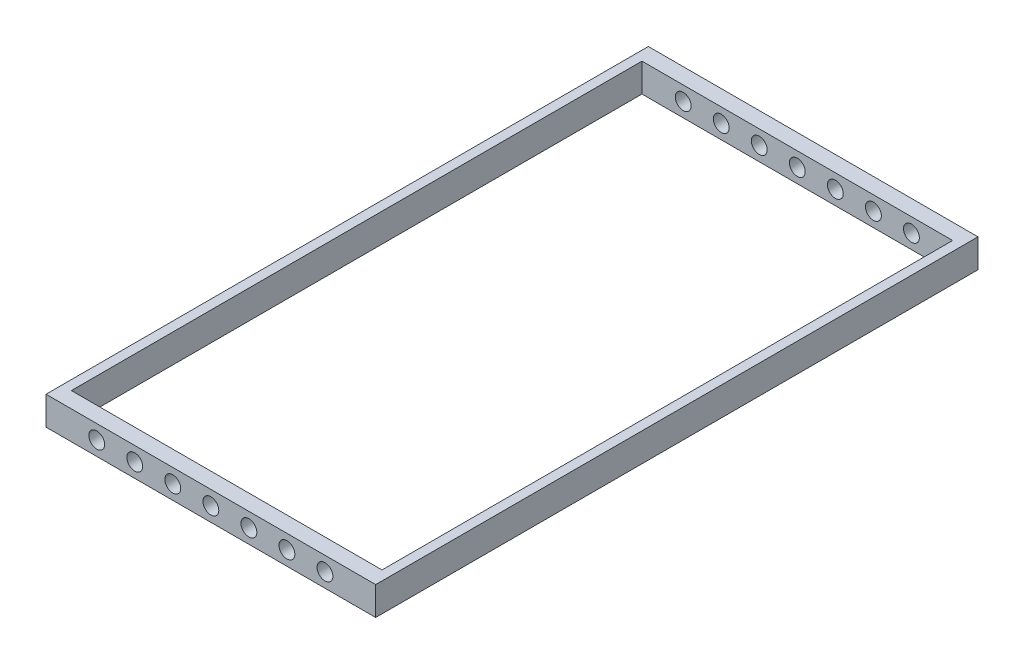
ISO-10303-21;
HEADER;
FILE_DESCRIPTION(('STEP AP214'),'2;1');
FILE_NAME('part.step','',(''),(''),'','','');
FILE_SCHEMA(('AUTOMOTIVE_DESIGN { 1 0 10303 214 1 1 1 1 }'));
ENDSEC;
DATA;
#1=APPLICATION_CONTEXT('core data for automotive mechanical design processes');
#2=APPLICATION_PROTOCOL_DEFINITION('international standard','automotive_design',2000,#1);
#3=PRODUCT_CONTEXT('',#1,'mechanical');
#4=PRODUCT('Part','Part','',(#3));
#5=PRODUCT_RELATED_PRODUCT_CATEGORY('part','',(#4));
#6=PRODUCT_DEFINITION_FORMATION('','',#4);
#7=PRODUCT_DEFINITION_CONTEXT('part definition',#1,'design');
#8=PRODUCT_DEFINITION('design','',#6,#7);
#9=PRODUCT_DEFINITION_SHAPE('','',#8);
#10=(LENGTH_UNIT() NAMED_UNIT(*) SI_UNIT(.MILLI.,.METRE.));
#11=(NAMED_UNIT(*) PLANE_ANGLE_UNIT() SI_UNIT($,.RADIAN.));
#12=(NAMED_UNIT(*) SI_UNIT($,.STERADIAN.) SOLID_ANGLE_UNIT());
#13=UNCERTAINTY_MEASURE_WITH_UNIT(LENGTH_MEASURE(1.E-05),#10,'distance_accuracy_value','');
#14=(GEOMETRIC_REPRESENTATION_CONTEXT(3) GLOBAL_UNCERTAINTY_ASSIGNED_CONTEXT((#13)) GLOBAL_UNIT_ASSIGNED_CONTEXT((#10,
#11,#12)) REPRESENTATION_CONTEXT('',''));
#15=CARTESIAN_POINT('',(0.,0.,0.));
#16=DIRECTION('',(0.,0.,1.));
#17=DIRECTION('',(1.,0.,0.));
#18=AXIS2_PLACEMENT_3D('',#15,#16,#17);
#19=CARTESIAN_POINT('',(0.,0.,0.));
#20=DIRECTION('',(0.,0.,1.));
#21=DIRECTION('',(1.,0.,0.));
#22=AXIS2_PLACEMENT_3D('',#19,#20,#21);
#23=PLANE('',#22);
#24=CARTESIAN_POINT('',(-36.,0.,0.));
#25=DIRECTION('',(0.,0.,1.));
#26=DIRECTION('',(1.,0.,0.));
#27=AXIS2_PLACEMENT_3D('',#24,#25,#26);
#28=CIRCLE('',#27,2.5);
#29=CARTESIAN_POINT('',(-33.5,0.,0.));
#30=VERTEX_POINT('',#29);
#31=EDGE_CURVE('E266',#30,#30,#28,.T.);
#32=ORIENTED_EDGE('',*,*,#31,.T.);
#33=EDGE_LOOP('',(#32));
#34=FACE_BOUND('',#33,.T.);
#35=CARTESIAN_POINT('',(-24.,0.,0.));
#36=DIRECTION('',(0.,0.,1.));
#37=DIRECTION('',(1.,0.,0.));
#38=AXIS2_PLACEMENT_3D('',#35,#36,#37);
#39=CIRCLE('',#38,2.5);
#40=CARTESIAN_POINT('',(-21.5,0.,0.));
#41=VERTEX_POINT('',#40);
#42=EDGE_CURVE('E258',#41,#41,#39,.T.);
#43=ORIENTED_EDGE('',*,*,#42,.T.);
#44=EDGE_LOOP('',(#43));
#45=FACE_BOUND('',#44,.T.);
#46=CARTESIAN_POINT('',(-12.,0.,0.));
#47=DIRECTION('',(0.,0.,1.));
#48=DIRECTION('',(1.,0.,0.));
#49=AXIS2_PLACEMENT_3D('',#46,#47,#48);
#50=CIRCLE('',#49,2.5);
#51=CARTESIAN_POINT('',(-9.50000000000003,0.,0.));
#52=VERTEX_POINT('',#51);
#53=EDGE_CURVE('E250',#52,#52,#50,.T.);
#54=ORIENTED_EDGE('',*,*,#53,.T.);
#55=EDGE_LOOP('',(#54));
#56=FACE_BOUND('',#55,.T.);
#57=CARTESIAN_POINT('',(0.,0.,0.));
#58=DIRECTION('',(0.,0.,1.));
#59=DIRECTION('',(1.,0.,0.));
#60=AXIS2_PLACEMENT_3D('',#57,#58,#59);
#61=CIRCLE('',#60,2.5);
#62=CARTESIAN_POINT('',(2.49999999999997,0.,0.));
#63=VERTEX_POINT('',#62);
#64=EDGE_CURVE('E242',#63,#63,#61,.T.);
#65=ORIENTED_EDGE('',*,*,#64,.T.);
#66=EDGE_LOOP('',(#65));
#67=FACE_BOUND('',#66,.T.);
#68=CARTESIAN_POINT('',(12.,0.,0.));
#69=DIRECTION('',(0.,0.,1.));
#70=DIRECTION('',(1.,0.,0.));
#71=AXIS2_PLACEMENT_3D('',#68,#69,#70);
#72=CIRCLE('',#71,2.5);
#73=CARTESIAN_POINT('',(14.5,0.,0.));
#74=VERTEX_POINT('',#73);
#75=EDGE_CURVE('E234',#74,#74,#72,.T.);
#76=ORIENTED_EDGE('',*,*,#75,.T.);
#77=EDGE_LOOP('',(#76));
#78=FACE_BOUND('',#77,.T.);
#79=CARTESIAN_POINT('',(24.,0.,0.));
#80=DIRECTION('',(0.,0.,1.));
#81=DIRECTION('',(1.,0.,0.));
#82=AXIS2_PLACEMENT_3D('',#79,#80,#81);
#83=CIRCLE('',#82,2.5);
#84=CARTESIAN_POINT('',(26.5,0.,0.));
#85=VERTEX_POINT('',#84);
#86=EDGE_CURVE('E226',#85,#85,#83,.T.);
#87=ORIENTED_EDGE('',*,*,#86,.T.);
#88=EDGE_LOOP('',(#87));
#89=FACE_BOUND('',#88,.T.);
#90=CARTESIAN_POINT('',(36.,0.,0.));
#91=DIRECTION('',(0.,0.,1.));
#92=DIRECTION('',(1.,0.,0.));
#93=AXIS2_PLACEMENT_3D('',#90,#91,#92);
#94=CIRCLE('',#93,2.5);
#95=CARTESIAN_POINT('',(38.5,0.,0.));
#96=VERTEX_POINT('',#95);
#97=EDGE_CURVE('E221',#96,#96,#94,.T.);
#98=ORIENTED_EDGE('',*,*,#97,.T.);
#99=EDGE_LOOP('',(#98));
#100=FACE_BOUND('',#99,.T.);
#101=DIRECTION('',(0.,-1.,0.));
#102=VECTOR('',#101,1.);
#103=CARTESIAN_POINT('',(-49.,4.5,0.));
#104=LINE('',#103,#102);
#105=CARTESIAN_POINT('',(-49.,4.5,0.));
#106=VERTEX_POINT('',#105);
#107=CARTESIAN_POINT('',(-49.,-4.5,0.));
#108=VERTEX_POINT('',#107);
#109=EDGE_CURVE('E203',#106,#108,#104,.T.);
#110=ORIENTED_EDGE('',*,*,#109,.F.);
#111=DIRECTION('',(-1.,0.,0.));
#112=VECTOR('',#111,1.);
#113=CARTESIAN_POINT('',(-52.,4.5,0.));
#114=LINE('',#113,#112);
#115=CARTESIAN_POINT('',(49.,4.5,0.));
#116=VERTEX_POINT('',#115);
#117=EDGE_CURVE('E109',#116,#106,#114,.T.);
#118=ORIENTED_EDGE('',*,*,#117,.F.);
#119=DIRECTION('',(0.,1.,0.));
#120=VECTOR('',#119,1.);
#121=CARTESIAN_POINT('',(49.,4.5,0.));
#122=LINE('',#121,#120);
#123=CARTESIAN_POINT('',(49.,-4.5,0.));
#124=VERTEX_POINT('',#123);
#125=EDGE_CURVE('E114',#124,#116,#122,.T.);
#126=ORIENTED_EDGE('',*,*,#125,.F.);
#127=DIRECTION('',(1.,0.,0.));
#128=VECTOR('',#127,1.);
#129=CARTESIAN_POINT('',(-52.,-4.5,0.));
#130=LINE('',#129,#128);
#131=EDGE_CURVE('E60',#108,#124,#130,.T.);
#132=ORIENTED_EDGE('',*,*,#131,.F.);
#133=EDGE_LOOP('',(#110,#118,#126,#132));
#134=FACE_BOUND('',#133,.T.);
#135=ADVANCED_FACE('F39',(#34,#45,#56,#67,#78,#89,#100,#134),#23,.F.);
#136=CARTESIAN_POINT('',(0.,0.,5.));
#137=DIRECTION('',(0.,0.,1.));
#138=DIRECTION('',(1.,0.,0.));
#139=AXIS2_PLACEMENT_3D('',#136,#137,#138);
#140=PLANE('',#139);
#141=CARTESIAN_POINT('',(24.,0.,5.));
#142=DIRECTION('',(0.,0.,1.));
#143=DIRECTION('',(1.,0.,0.));
#144=AXIS2_PLACEMENT_3D('',#141,#142,#143);
#145=CIRCLE('',#144,2.5);
#146=CARTESIAN_POINT('',(26.5,0.,5.));
#147=VERTEX_POINT('',#146);
#148=EDGE_CURVE('E230',#147,#147,#145,.T.);
#149=ORIENTED_EDGE('',*,*,#148,.F.);
#150=EDGE_LOOP('',(#149));
#151=FACE_BOUND('',#150,.T.);
#152=CARTESIAN_POINT('',(0.,0.,5.));
#153=DIRECTION('',(0.,0.,1.));
#154=DIRECTION('',(1.,0.,0.));
#155=AXIS2_PLACEMENT_3D('',#152,#153,#154);
#156=CIRCLE('',#155,2.5);
#157=CARTESIAN_POINT('',(2.49999999999997,0.,5.));
#158=VERTEX_POINT('',#157);
#159=EDGE_CURVE('E246',#158,#158,#156,.T.);
#160=ORIENTED_EDGE('',*,*,#159,.F.);
#161=EDGE_LOOP('',(#160));
#162=FACE_BOUND('',#161,.T.);
#163=CARTESIAN_POINT('',(-24.,0.,5.));
#164=DIRECTION('',(0.,0.,1.));
#165=DIRECTION('',(1.,0.,0.));
#166=AXIS2_PLACEMENT_3D('',#163,#164,#165);
#167=CIRCLE('',#166,2.5);
#168=CARTESIAN_POINT('',(-21.5,0.,5.));
#169=VERTEX_POINT('',#168);
#170=EDGE_CURVE('E262',#169,#169,#167,.T.);
#171=ORIENTED_EDGE('',*,*,#170,.F.);
#172=EDGE_LOOP('',(#171));
#173=FACE_BOUND('',#172,.T.);
#174=DIRECTION('',(0.,1.,0.));
#175=VECTOR('',#174,1.);
#176=CARTESIAN_POINT('',(52.,4.5,5.));
#177=LINE('',#176,#175);
#178=CARTESIAN_POINT('',(52.,-4.5,5.));
#179=VERTEX_POINT('',#178);
#180=CARTESIAN_POINT('',(52.,4.5,5.));
#181=VERTEX_POINT('',#180);
#182=EDGE_CURVE('E277',#179,#181,#177,.T.);
#183=ORIENTED_EDGE('',*,*,#182,.T.);
#184=DIRECTION('',(-1.,0.,0.));
#185=VECTOR('',#184,1.);
#186=CARTESIAN_POINT('',(-52.,4.5,5.));
#187=LINE('',#186,#185);
#188=CARTESIAN_POINT('',(-52.,4.5,5.));
#189=VERTEX_POINT('',#188);
#190=EDGE_CURVE('E281',#181,#189,#187,.T.);
#191=ORIENTED_EDGE('',*,*,#190,.T.);
#192=DIRECTION('',(0.,-1.,0.));
#193=VECTOR('',#192,1.);
#194=CARTESIAN_POINT('',(-52.,4.5,5.));
#195=LINE('',#194,#193);
#196=CARTESIAN_POINT('',(-52.,-4.5,5.));
#197=VERTEX_POINT('',#196);
#198=EDGE_CURVE('E284',#189,#197,#195,.T.);
#199=ORIENTED_EDGE('',*,*,#198,.T.);
#200=DIRECTION('',(1.,0.,0.));
#201=VECTOR('',#200,1.);
#202=CARTESIAN_POINT('',(-52.,-4.5,5.));
#203=LINE('',#202,#201);
#204=EDGE_CURVE('E287',#197,#179,#203,.T.);
#205=ORIENTED_EDGE('',*,*,#204,.T.);
#206=EDGE_LOOP('',(#183,#191,#199,#205));
#207=FACE_BOUND('',#206,.T.);
#208=CARTESIAN_POINT('',(-36.,0.,5.));
#209=DIRECTION('',(0.,0.,1.));
#210=DIRECTION('',(1.,0.,0.));
#211=AXIS2_PLACEMENT_3D('',#208,#209,#210);
#212=CIRCLE('',#211,2.5);
#213=CARTESIAN_POINT('',(-33.5,0.,5.));
#214=VERTEX_POINT('',#213);
#215=EDGE_CURVE('E270',#214,#214,#212,.T.);
#216=ORIENTED_EDGE('',*,*,#215,.F.);
#217=EDGE_LOOP('',(#216));
#218=FACE_BOUND('',#217,.T.);
#219=CARTESIAN_POINT('',(-12.,0.,5.));
#220=DIRECTION('',(0.,0.,1.));
#221=DIRECTION('',(1.,0.,0.));
#222=AXIS2_PLACEMENT_3D('',#219,#220,#221);
#223=CIRCLE('',#222,2.5);
#224=CARTESIAN_POINT('',(-9.50000000000003,0.,5.));
#225=VERTEX_POINT('',#224);
#226=EDGE_CURVE('E254',#225,#225,#223,.T.);
#227=ORIENTED_EDGE('',*,*,#226,.F.);
#228=EDGE_LOOP('',(#227));
#229=FACE_BOUND('',#228,.T.);
#230=CARTESIAN_POINT('',(12.,0.,5.));
#231=DIRECTION('',(0.,0.,1.));
#232=DIRECTION('',(1.,0.,0.));
#233=AXIS2_PLACEMENT_3D('',#230,#231,#232);
#234=CIRCLE('',#233,2.5);
#235=CARTESIAN_POINT('',(14.5,0.,5.));
#236=VERTEX_POINT('',#235);
#237=EDGE_CURVE('E238',#236,#236,#234,.T.);
#238=ORIENTED_EDGE('',*,*,#237,.F.);
#239=EDGE_LOOP('',(#238));
#240=FACE_BOUND('',#239,.T.);
#241=CARTESIAN_POINT('',(36.,0.,5.));
#242=DIRECTION('',(0.,0.,1.));
#243=DIRECTION('',(1.,0.,0.));
#244=AXIS2_PLACEMENT_3D('',#241,#242,#243);
#245=CIRCLE('',#244,2.5);
#246=CARTESIAN_POINT('',(38.5,0.,5.));
#247=VERTEX_POINT('',#246);
#248=EDGE_CURVE('E222',#247,#247,#245,.T.);
#249=ORIENTED_EDGE('',*,*,#248,.F.);
#250=EDGE_LOOP('',(#249));
#251=FACE_BOUND('',#250,.T.);
#252=ADVANCED_FACE('F320',(#151,#162,#173,#207,#218,#229,#240,#251),#140,.T.);
#253=CARTESIAN_POINT('',(52.,4.5,5.));
#254=DIRECTION('',(-1.,0.,0.));
#255=DIRECTION('',(0.,0.,1.));
#256=AXIS2_PLACEMENT_3D('',#253,#254,#255);
#257=PLANE('',#256);
#258=DIRECTION('',(0.,0.,-1.));
#259=VECTOR('',#258,1.);
#260=CARTESIAN_POINT('',(52.,-4.5,5.));
#261=LINE('',#260,#259);
#262=CARTESIAN_POINT('',(52.,-4.5,-185.));
#263=VERTEX_POINT('',#262);
#264=EDGE_CURVE('E290',#179,#263,#261,.T.);
#265=ORIENTED_EDGE('',*,*,#264,.T.);
#266=DIRECTION('',(0.,1.,0.));
#267=VECTOR('',#266,1.);
#268=CARTESIAN_POINT('',(52.,4.5,-185.));
#269=LINE('',#268,#267);
#270=CARTESIAN_POINT('',(52.,4.5,-185.));
#271=VERTEX_POINT('',#270);
#272=EDGE_CURVE('E188',#263,#271,#269,.T.);
#273=ORIENTED_EDGE('',*,*,#272,.T.);
#274=DIRECTION('',(0.,0.,-1.));
#275=VECTOR('',#274,1.);
#276=CARTESIAN_POINT('',(52.,4.5,5.));
#277=LINE('',#276,#275);
#278=EDGE_CURVE('E11',#181,#271,#277,.T.);
#279=ORIENTED_EDGE('',*,*,#278,.F.);
#280=ORIENTED_EDGE('',*,*,#182,.F.);
#281=EDGE_LOOP('',(#265,#273,#279,#280));
#282=FACE_BOUND('',#281,.T.);
#283=ADVANCED_FACE('F41',(#282),#257,.F.);
#284=CARTESIAN_POINT('',(-52.,4.5,5.));
#285=DIRECTION('',(0.,-1.,0.));
#286=DIRECTION('',(0.,0.,-1.));
#287=AXIS2_PLACEMENT_3D('',#284,#285,#286);
#288=PLANE('',#287);
#289=ORIENTED_EDGE('',*,*,#278,.T.);
#290=DIRECTION('',(-1.,0.,0.));
#291=VECTOR('',#290,1.);
#292=CARTESIAN_POINT('',(-52.,4.5,-185.));
#293=LINE('',#292,#291);
#294=CARTESIAN_POINT('',(-52.,4.5,-185.));
#295=VERTEX_POINT('',#294);
#296=EDGE_CURVE('E192',#271,#295,#293,.T.);
#297=ORIENTED_EDGE('',*,*,#296,.T.);
#298=DIRECTION('',(0.,0.,-1.));
#299=VECTOR('',#298,1.);
#300=CARTESIAN_POINT('',(-52.,4.5,5.));
#301=LINE('',#300,#299);
#302=EDGE_CURVE('E48',#189,#295,#301,.T.);
#303=ORIENTED_EDGE('',*,*,#302,.F.);
#304=ORIENTED_EDGE('',*,*,#190,.F.);
#305=EDGE_LOOP('',(#289,#297,#303,#304));
#306=FACE_BOUND('',#305,.T.);
#307=DIRECTION('',(-1.,0.,0.));
#308=VECTOR('',#307,1.);
#309=CARTESIAN_POINT('',(-52.,4.5,-180.));
#310=LINE('',#309,#308);
#311=CARTESIAN_POINT('',(49.,4.5,-180.));
#312=VERTEX_POINT('',#311);
#313=CARTESIAN_POINT('',(-49.,4.5,-180.));
#314=VERTEX_POINT('',#313);
#315=EDGE_CURVE('E107',#312,#314,#310,.T.);
#316=ORIENTED_EDGE('',*,*,#315,.F.);
#317=DIRECTION('',(0.,0.,1.));
#318=VECTOR('',#317,1.);
#319=CARTESIAN_POINT('',(49.,4.5,-90.));
#320=LINE('',#319,#318);
#321=EDGE_CURVE('E214',#312,#116,#320,.T.);
#322=ORIENTED_EDGE('',*,*,#321,.T.);
#323=ORIENTED_EDGE('',*,*,#117,.T.);
#324=DIRECTION('',(0.,0.,1.));
#325=VECTOR('',#324,1.);
#326=CARTESIAN_POINT('',(-49.,4.5,-90.));
#327=LINE('',#326,#325);
#328=EDGE_CURVE('E103',#314,#106,#327,.T.);
#329=ORIENTED_EDGE('',*,*,#328,.F.);
#330=EDGE_LOOP('',(#316,#322,#323,#329));
#331=FACE_BOUND('',#330,.T.);
#332=ADVANCED_FACE('F105',(#306,#331),#288,.F.);
#333=CARTESIAN_POINT('',(-52.,4.5,5.));
#334=DIRECTION('',(1.,0.,0.));
#335=DIRECTION('',(0.,0.,-1.));
#336=AXIS2_PLACEMENT_3D('',#333,#334,#335);
#337=PLANE('',#336);
#338=ORIENTED_EDGE('',*,*,#302,.T.);
#339=DIRECTION('',(0.,-1.,0.));
#340=VECTOR('',#339,1.);
#341=CARTESIAN_POINT('',(-52.,4.5,-185.));
#342=LINE('',#341,#340);
#343=CARTESIAN_POINT('',(-52.,-4.5,-185.));
#344=VERTEX_POINT('',#343);
#345=EDGE_CURVE('E196',#295,#344,#342,.T.);
#346=ORIENTED_EDGE('',*,*,#345,.T.);
#347=DIRECTION('',(0.,0.,-1.));
#348=VECTOR('',#347,1.);
#349=CARTESIAN_POINT('',(-52.,-4.5,5.));
#350=LINE('',#349,#348);
#351=EDGE_CURVE('E297',#197,#344,#350,.T.);
#352=ORIENTED_EDGE('',*,*,#351,.F.);
#353=ORIENTED_EDGE('',*,*,#198,.F.);
#354=EDGE_LOOP('',(#338,#346,#352,#353));
#355=FACE_BOUND('',#354,.T.);
#356=ADVANCED_FACE('F303',(#355),#337,.F.);
#357=CARTESIAN_POINT('',(-52.,-4.5,5.));
#358=DIRECTION('',(0.,1.,0.));
#359=DIRECTION('',(0.,0.,1.));
#360=AXIS2_PLACEMENT_3D('',#357,#358,#359);
#361=PLANE('',#360);
#362=DIRECTION('',(0.,0.,1.));
#363=VECTOR('',#362,1.);
#364=CARTESIAN_POINT('',(49.,-4.5,-90.));
#365=LINE('',#364,#363);
#366=CARTESIAN_POINT('',(49.,-4.5,-180.));
#367=VERTEX_POINT('',#366);
#368=EDGE_CURVE('E217',#367,#124,#365,.T.);
#369=ORIENTED_EDGE('',*,*,#368,.F.);
#370=DIRECTION('',(1.,0.,0.));
#371=VECTOR('',#370,1.);
#372=CARTESIAN_POINT('',(-52.,-4.5,-180.));
#373=LINE('',#372,#371);
#374=CARTESIAN_POINT('',(-49.,-4.5,-180.));
#375=VERTEX_POINT('',#374);
#376=EDGE_CURVE('E124',#375,#367,#373,.T.);
#377=ORIENTED_EDGE('',*,*,#376,.F.);
#378=DIRECTION('',(0.,0.,1.));
#379=VECTOR('',#378,1.);
#380=CARTESIAN_POINT('',(-49.,-4.5,-90.));
#381=LINE('',#380,#379);
#382=EDGE_CURVE('E55',#375,#108,#381,.T.);
#383=ORIENTED_EDGE('',*,*,#382,.T.);
#384=ORIENTED_EDGE('',*,*,#131,.T.);
#385=EDGE_LOOP('',(#369,#377,#383,#384));
#386=FACE_BOUND('',#385,.T.);
#387=ORIENTED_EDGE('',*,*,#351,.T.);
#388=DIRECTION('',(1.,0.,0.));
#389=VECTOR('',#388,1.);
#390=CARTESIAN_POINT('',(-52.,-4.5,-185.));
#391=LINE('',#390,#389);
#392=EDGE_CURVE('E200',#344,#263,#391,.T.);
#393=ORIENTED_EDGE('',*,*,#392,.T.);
#394=ORIENTED_EDGE('',*,*,#264,.F.);
#395=ORIENTED_EDGE('',*,*,#204,.F.);
#396=EDGE_LOOP('',(#387,#393,#394,#395));
#397=FACE_BOUND('',#396,.T.);
#398=ADVANCED_FACE('F316',(#386,#397),#361,.F.);
#399=CARTESIAN_POINT('',(-36.,0.,5.));
#400=DIRECTION('',(0.,0.,-1.));
#401=DIRECTION('',(-1.,0.,0.));
#402=AXIS2_PLACEMENT_3D('',#399,#400,#401);
#403=CYLINDRICAL_SURFACE('',#402,2.5);
#404=ORIENTED_EDGE('',*,*,#215,.T.);
#405=EDGE_LOOP('',(#404));
#406=FACE_BOUND('',#405,.T.);
#407=ORIENTED_EDGE('',*,*,#31,.F.);
#408=EDGE_LOOP('',(#407));
#409=FACE_BOUND('',#408,.T.);
#410=ADVANCED_FACE('F340',(#406,#409),#403,.F.);
#411=CARTESIAN_POINT('',(-24.,0.,5.));
#412=DIRECTION('',(0.,0.,-1.));
#413=DIRECTION('',(-1.,0.,0.));
#414=AXIS2_PLACEMENT_3D('',#411,#412,#413);
#415=CYLINDRICAL_SURFACE('',#414,2.5);
#416=ORIENTED_EDGE('',*,*,#170,.T.);
#417=EDGE_LOOP('',(#416));
#418=FACE_BOUND('',#417,.T.);
#419=ORIENTED_EDGE('',*,*,#42,.F.);
#420=EDGE_LOOP('',(#419));
#421=FACE_BOUND('',#420,.T.);
#422=ADVANCED_FACE('F357',(#418,#421),#415,.F.);
#423=CARTESIAN_POINT('',(-12.,0.,5.));
#424=DIRECTION('',(0.,0.,-1.));
#425=DIRECTION('',(-1.,0.,0.));
#426=AXIS2_PLACEMENT_3D('',#423,#424,#425);
#427=CYLINDRICAL_SURFACE('',#426,2.5);
#428=ORIENTED_EDGE('',*,*,#226,.T.);
#429=EDGE_LOOP('',(#428));
#430=FACE_BOUND('',#429,.T.);
#431=ORIENTED_EDGE('',*,*,#53,.F.);
#432=EDGE_LOOP('',(#431));
#433=FACE_BOUND('',#432,.T.);
#434=ADVANCED_FACE('F365',(#430,#433),#427,.F.);
#435=CARTESIAN_POINT('',(0.,0.,5.));
#436=DIRECTION('',(0.,0.,-1.));
#437=DIRECTION('',(-1.,0.,0.));
#438=AXIS2_PLACEMENT_3D('',#435,#436,#437);
#439=CYLINDRICAL_SURFACE('',#438,2.5);
#440=ORIENTED_EDGE('',*,*,#159,.T.);
#441=EDGE_LOOP('',(#440));
#442=FACE_BOUND('',#441,.T.);
#443=ORIENTED_EDGE('',*,*,#64,.F.);
#444=EDGE_LOOP('',(#443));
#445=FACE_BOUND('',#444,.T.);
#446=ADVANCED_FACE('F373',(#442,#445),#439,.F.);
#447=CARTESIAN_POINT('',(12.,0.,5.));
#448=DIRECTION('',(0.,0.,-1.));
#449=DIRECTION('',(-1.,0.,0.));
#450=AXIS2_PLACEMENT_3D('',#447,#448,#449);
#451=CYLINDRICAL_SURFACE('',#450,2.5);
#452=ORIENTED_EDGE('',*,*,#237,.T.);
#453=EDGE_LOOP('',(#452));
#454=FACE_BOUND('',#453,.T.);
#455=ORIENTED_EDGE('',*,*,#75,.F.);
#456=EDGE_LOOP('',(#455));
#457=FACE_BOUND('',#456,.T.);
#458=ADVANCED_FACE('F381',(#454,#457),#451,.F.);
#459=CARTESIAN_POINT('',(24.,0.,5.));
#460=DIRECTION('',(0.,0.,-1.));
#461=DIRECTION('',(-1.,0.,0.));
#462=AXIS2_PLACEMENT_3D('',#459,#460,#461);
#463=CYLINDRICAL_SURFACE('',#462,2.5);
#464=ORIENTED_EDGE('',*,*,#148,.T.);
#465=EDGE_LOOP('',(#464));
#466=FACE_BOUND('',#465,.T.);
#467=ORIENTED_EDGE('',*,*,#86,.F.);
#468=EDGE_LOOP('',(#467));
#469=FACE_BOUND('',#468,.T.);
#470=ADVANCED_FACE('F389',(#466,#469),#463,.F.);
#471=CARTESIAN_POINT('',(36.,0.,5.));
#472=DIRECTION('',(0.,0.,-1.));
#473=DIRECTION('',(-1.,0.,0.));
#474=AXIS2_PLACEMENT_3D('',#471,#472,#473);
#475=CYLINDRICAL_SURFACE('',#474,2.5);
#476=ORIENTED_EDGE('',*,*,#248,.T.);
#477=EDGE_LOOP('',(#476));
#478=FACE_BOUND('',#477,.T.);
#479=ORIENTED_EDGE('',*,*,#97,.F.);
#480=EDGE_LOOP('',(#479));
#481=FACE_BOUND('',#480,.T.);
#482=ADVANCED_FACE('F397',(#478,#481),#475,.F.);
#483=CARTESIAN_POINT('',(49.,4.5,-90.));
#484=DIRECTION('',(1.,0.,0.));
#485=DIRECTION('',(0.,1.,0.));
#486=AXIS2_PLACEMENT_3D('',#483,#484,#485);
#487=PLANE('',#486);
#488=ORIENTED_EDGE('',*,*,#125,.T.);
#489=ORIENTED_EDGE('',*,*,#321,.F.);
#490=DIRECTION('',(0.,1.,0.));
#491=VECTOR('',#490,1.);
#492=CARTESIAN_POINT('',(49.,4.5,-180.));
#493=LINE('',#492,#491);
#494=EDGE_CURVE('E122',#367,#312,#493,.T.);
#495=ORIENTED_EDGE('',*,*,#494,.F.);
#496=ORIENTED_EDGE('',*,*,#368,.T.);
#497=EDGE_LOOP('',(#488,#489,#495,#496));
#498=FACE_BOUND('',#497,.T.);
#499=ADVANCED_FACE('F405',(#498),#487,.F.);
#500=CARTESIAN_POINT('',(-49.,4.5,-90.));
#501=DIRECTION('',(-1.,0.,0.));
#502=DIRECTION('',(0.,0.,1.));
#503=AXIS2_PLACEMENT_3D('',#500,#501,#502);
#504=PLANE('',#503);
#505=ORIENTED_EDGE('',*,*,#109,.T.);
#506=ORIENTED_EDGE('',*,*,#382,.F.);
#507=DIRECTION('',(0.,-1.,0.));
#508=VECTOR('',#507,1.);
#509=CARTESIAN_POINT('',(-49.,4.5,-180.));
#510=LINE('',#509,#508);
#511=EDGE_CURVE('E120',#314,#375,#510,.T.);
#512=ORIENTED_EDGE('',*,*,#511,.F.);
#513=ORIENTED_EDGE('',*,*,#328,.T.);
#514=EDGE_LOOP('',(#505,#506,#512,#513));
#515=FACE_BOUND('',#514,.T.);
#516=ADVANCED_FACE('F127',(#515),#504,.F.);
#517=CARTESIAN_POINT('',(0.,0.,-180.));
#518=DIRECTION('',(0.,0.,-1.));
#519=DIRECTION('',(1.,0.,0.));
#520=AXIS2_PLACEMENT_3D('',#517,#518,#519);
#521=PLANE('',#520);
#522=CARTESIAN_POINT('',(-36.,0.,-180.));
#523=DIRECTION('',(0.,0.,1.));
#524=DIRECTION('',(1.,0.,0.));
#525=AXIS2_PLACEMENT_3D('',#522,#523,#524);
#526=CIRCLE('',#525,2.5);
#527=CARTESIAN_POINT('',(-33.5,0.,-180.));
#528=VERTEX_POINT('',#527);
#529=EDGE_CURVE('E178',#528,#528,#526,.T.);
#530=ORIENTED_EDGE('',*,*,#529,.F.);
#531=EDGE_LOOP('',(#530));
#532=FACE_BOUND('',#531,.T.);
#533=CARTESIAN_POINT('',(-24.,0.,-180.));
#534=DIRECTION('',(0.,0.,1.));
#535=DIRECTION('',(1.,0.,0.));
#536=AXIS2_PLACEMENT_3D('',#533,#534,#535);
#537=CIRCLE('',#536,2.5);
#538=CARTESIAN_POINT('',(-21.5,0.,-180.));
#539=VERTEX_POINT('',#538);
#540=EDGE_CURVE('E170',#539,#539,#537,.T.);
#541=ORIENTED_EDGE('',*,*,#540,.F.);
#542=EDGE_LOOP('',(#541));
#543=FACE_BOUND('',#542,.T.);
#544=CARTESIAN_POINT('',(-12.,0.,-180.));
#545=DIRECTION('',(0.,0.,1.));
#546=DIRECTION('',(1.,0.,0.));
#547=AXIS2_PLACEMENT_3D('',#544,#545,#546);
#548=CIRCLE('',#547,2.5);
#549=CARTESIAN_POINT('',(-9.50000000000003,0.,-180.));
#550=VERTEX_POINT('',#549);
#551=EDGE_CURVE('E162',#550,#550,#548,.T.);
#552=ORIENTED_EDGE('',*,*,#551,.F.);
#553=EDGE_LOOP('',(#552));
#554=FACE_BOUND('',#553,.T.);
#555=CARTESIAN_POINT('',(0.,0.,-180.));
#556=DIRECTION('',(0.,0.,1.));
#557=DIRECTION('',(1.,0.,0.));
#558=AXIS2_PLACEMENT_3D('',#555,#556,#557);
#559=CIRCLE('',#558,2.5);
#560=CARTESIAN_POINT('',(2.49999999999997,0.,-180.));
#561=VERTEX_POINT('',#560);
#562=EDGE_CURVE('E154',#561,#561,#559,.T.);
#563=ORIENTED_EDGE('',*,*,#562,.F.);
#564=EDGE_LOOP('',(#563));
#565=FACE_BOUND('',#564,.T.);
#566=CARTESIAN_POINT('',(12.,0.,-180.));
#567=DIRECTION('',(0.,0.,1.));
#568=DIRECTION('',(1.,0.,0.));
#569=AXIS2_PLACEMENT_3D('',#566,#567,#568);
#570=CIRCLE('',#569,2.5);
#571=CARTESIAN_POINT('',(14.5,0.,-180.));
#572=VERTEX_POINT('',#571);
#573=EDGE_CURVE('E146',#572,#572,#570,.T.);
#574=ORIENTED_EDGE('',*,*,#573,.F.);
#575=EDGE_LOOP('',(#574));
#576=FACE_BOUND('',#575,.T.);
#577=CARTESIAN_POINT('',(24.,0.,-180.));
#578=DIRECTION('',(0.,0.,1.));
#579=DIRECTION('',(1.,0.,0.));
#580=AXIS2_PLACEMENT_3D('',#577,#578,#579);
#581=CIRCLE('',#580,2.5);
#582=CARTESIAN_POINT('',(26.5,0.,-180.));
#583=VERTEX_POINT('',#582);
#584=EDGE_CURVE('E138',#583,#583,#581,.T.);
#585=ORIENTED_EDGE('',*,*,#584,.F.);
#586=EDGE_LOOP('',(#585));
#587=FACE_BOUND('',#586,.T.);
#588=CARTESIAN_POINT('',(36.,0.,-180.));
#589=DIRECTION('',(0.,0.,1.));
#590=DIRECTION('',(1.,0.,0.));
#591=AXIS2_PLACEMENT_3D('',#588,#589,#590);
#592=CIRCLE('',#591,2.5);
#593=CARTESIAN_POINT('',(38.5,0.,-180.));
#594=VERTEX_POINT('',#593);
#595=EDGE_CURVE('E131',#594,#594,#592,.T.);
#596=ORIENTED_EDGE('',*,*,#595,.F.);
#597=EDGE_LOOP('',(#596));
#598=FACE_BOUND('',#597,.T.);
#599=ORIENTED_EDGE('',*,*,#511,.T.);
#600=ORIENTED_EDGE('',*,*,#376,.T.);
#601=ORIENTED_EDGE('',*,*,#494,.T.);
#602=ORIENTED_EDGE('',*,*,#315,.T.);
#603=EDGE_LOOP('',(#599,#600,#601,#602));
#604=FACE_BOUND('',#603,.T.);
#605=ADVANCED_FACE('F118',(#532,#543,#554,#565,#576,#587,#598,#604),#521,.F.);
#606=CARTESIAN_POINT('',(0.,0.,-185.));
#607=DIRECTION('',(0.,0.,-1.));
#608=DIRECTION('',(1.,0.,0.));
#609=AXIS2_PLACEMENT_3D('',#606,#607,#608);
#610=PLANE('',#609);
#611=CARTESIAN_POINT('',(24.,0.,-185.));
#612=DIRECTION('',(0.,0.,1.));
#613=DIRECTION('',(1.,0.,0.));
#614=AXIS2_PLACEMENT_3D('',#611,#612,#613);
#615=CIRCLE('',#614,2.5);
#616=CARTESIAN_POINT('',(26.5,0.,-185.));
#617=VERTEX_POINT('',#616);
#618=EDGE_CURVE('E142',#617,#617,#615,.T.);
#619=ORIENTED_EDGE('',*,*,#618,.T.);
#620=EDGE_LOOP('',(#619));
#621=FACE_BOUND('',#620,.T.);
#622=CARTESIAN_POINT('',(0.,0.,-185.));
#623=DIRECTION('',(0.,0.,1.));
#624=DIRECTION('',(1.,0.,0.));
#625=AXIS2_PLACEMENT_3D('',#622,#623,#624);
#626=CIRCLE('',#625,2.5);
#627=CARTESIAN_POINT('',(2.49999999999997,0.,-185.));
#628=VERTEX_POINT('',#627);
#629=EDGE_CURVE('E158',#628,#628,#626,.T.);
#630=ORIENTED_EDGE('',*,*,#629,.T.);
#631=EDGE_LOOP('',(#630));
#632=FACE_BOUND('',#631,.T.);
#633=CARTESIAN_POINT('',(-24.,0.,-185.));
#634=DIRECTION('',(0.,0.,1.));
#635=DIRECTION('',(1.,0.,0.));
#636=AXIS2_PLACEMENT_3D('',#633,#634,#635);
#637=CIRCLE('',#636,2.5);
#638=CARTESIAN_POINT('',(-21.5,0.,-185.));
#639=VERTEX_POINT('',#638);
#640=EDGE_CURVE('E174',#639,#639,#637,.T.);
#641=ORIENTED_EDGE('',*,*,#640,.T.);
#642=EDGE_LOOP('',(#641));
#643=FACE_BOUND('',#642,.T.);
#644=ORIENTED_EDGE('',*,*,#272,.F.);
#645=ORIENTED_EDGE('',*,*,#392,.F.);
#646=ORIENTED_EDGE('',*,*,#345,.F.);
#647=ORIENTED_EDGE('',*,*,#296,.F.);
#648=EDGE_LOOP('',(#644,#645,#646,#647));
#649=FACE_BOUND('',#648,.T.);
#650=CARTESIAN_POINT('',(-36.,0.,-185.));
#651=DIRECTION('',(0.,0.,1.));
#652=DIRECTION('',(1.,0.,0.));
#653=AXIS2_PLACEMENT_3D('',#650,#651,#652);
#654=CIRCLE('',#653,2.5);
#655=CARTESIAN_POINT('',(-33.5,0.,-185.));
#656=VERTEX_POINT('',#655);
#657=EDGE_CURVE('E125',#656,#656,#654,.T.);
#658=ORIENTED_EDGE('',*,*,#657,.T.);
#659=EDGE_LOOP('',(#658));
#660=FACE_BOUND('',#659,.T.);
#661=CARTESIAN_POINT('',(-12.,0.,-185.));
#662=DIRECTION('',(0.,0.,1.));
#663=DIRECTION('',(1.,0.,0.));
#664=AXIS2_PLACEMENT_3D('',#661,#662,#663);
#665=CIRCLE('',#664,2.5);
#666=CARTESIAN_POINT('',(-9.50000000000003,0.,-185.));
#667=VERTEX_POINT('',#666);
#668=EDGE_CURVE('E166',#667,#667,#665,.T.);
#669=ORIENTED_EDGE('',*,*,#668,.T.);
#670=EDGE_LOOP('',(#669));
#671=FACE_BOUND('',#670,.T.);
#672=CARTESIAN_POINT('',(12.,0.,-185.));
#673=DIRECTION('',(0.,0.,1.));
#674=DIRECTION('',(1.,0.,0.));
#675=AXIS2_PLACEMENT_3D('',#672,#673,#674);
#676=CIRCLE('',#675,2.5);
#677=CARTESIAN_POINT('',(14.5,0.,-185.));
#678=VERTEX_POINT('',#677);
#679=EDGE_CURVE('E150',#678,#678,#676,.T.);
#680=ORIENTED_EDGE('',*,*,#679,.T.);
#681=EDGE_LOOP('',(#680));
#682=FACE_BOUND('',#681,.T.);
#683=CARTESIAN_POINT('',(36.,0.,-185.));
#684=DIRECTION('',(0.,0.,1.));
#685=DIRECTION('',(1.,0.,0.));
#686=AXIS2_PLACEMENT_3D('',#683,#684,#685);
#687=CIRCLE('',#686,2.5);
#688=CARTESIAN_POINT('',(38.5,0.,-185.));
#689=VERTEX_POINT('',#688);
#690=EDGE_CURVE('E134',#689,#689,#687,.T.);
#691=ORIENTED_EDGE('',*,*,#690,.T.);
#692=EDGE_LOOP('',(#691));
#693=FACE_BOUND('',#692,.T.);
#694=ADVANCED_FACE('F312',(#621,#632,#643,#649,#660,#671,#682,#693),#610,.T.);
#695=CARTESIAN_POINT('',(-36.,0.,-185.));
#696=DIRECTION('',(0.,0.,1.));
#697=DIRECTION('',(-1.,0.,0.));
#698=AXIS2_PLACEMENT_3D('',#695,#696,#697);
#699=CYLINDRICAL_SURFACE('',#698,2.5);
#700=ORIENTED_EDGE('',*,*,#657,.F.);
#701=EDGE_LOOP('',(#700));
#702=FACE_BOUND('',#701,.T.);
#703=ORIENTED_EDGE('',*,*,#529,.T.);
#704=EDGE_LOOP('',(#703));
#705=FACE_BOUND('',#704,.T.);
#706=ADVANCED_FACE('F432',(#702,#705),#699,.F.);
#707=CARTESIAN_POINT('',(-24.,0.,-185.));
#708=DIRECTION('',(0.,0.,1.));
#709=DIRECTION('',(-1.,0.,0.));
#710=AXIS2_PLACEMENT_3D('',#707,#708,#709);
#711=CYLINDRICAL_SURFACE('',#710,2.5);
#712=ORIENTED_EDGE('',*,*,#640,.F.);
#713=EDGE_LOOP('',(#712));
#714=FACE_BOUND('',#713,.T.);
#715=ORIENTED_EDGE('',*,*,#540,.T.);
#716=EDGE_LOOP('',(#715));
#717=FACE_BOUND('',#716,.T.);
#718=ADVANCED_FACE('F440',(#714,#717),#711,.F.);
#719=CARTESIAN_POINT('',(-12.,0.,-185.));
#720=DIRECTION('',(0.,0.,1.));
#721=DIRECTION('',(-1.,0.,0.));
#722=AXIS2_PLACEMENT_3D('',#719,#720,#721);
#723=CYLINDRICAL_SURFACE('',#722,2.5);
#724=ORIENTED_EDGE('',*,*,#668,.F.);
#725=EDGE_LOOP('',(#724));
#726=FACE_BOUND('',#725,.T.);
#727=ORIENTED_EDGE('',*,*,#551,.T.);
#728=EDGE_LOOP('',(#727));
#729=FACE_BOUND('',#728,.T.);
#730=ADVANCED_FACE('F448',(#726,#729),#723,.F.);
#731=CARTESIAN_POINT('',(0.,0.,-185.));
#732=DIRECTION('',(0.,0.,1.));
#733=DIRECTION('',(-1.,0.,0.));
#734=AXIS2_PLACEMENT_3D('',#731,#732,#733);
#735=CYLINDRICAL_SURFACE('',#734,2.5);
#736=ORIENTED_EDGE('',*,*,#629,.F.);
#737=EDGE_LOOP('',(#736));
#738=FACE_BOUND('',#737,.T.);
#739=ORIENTED_EDGE('',*,*,#562,.T.);
#740=EDGE_LOOP('',(#739));
#741=FACE_BOUND('',#740,.T.);
#742=ADVANCED_FACE('F456',(#738,#741),#735,.F.);
#743=CARTESIAN_POINT('',(12.,0.,-185.));
#744=DIRECTION('',(0.,0.,1.));
#745=DIRECTION('',(-1.,0.,0.));
#746=AXIS2_PLACEMENT_3D('',#743,#744,#745);
#747=CYLINDRICAL_SURFACE('',#746,2.5);
#748=ORIENTED_EDGE('',*,*,#679,.F.);
#749=EDGE_LOOP('',(#748));
#750=FACE_BOUND('',#749,.T.);
#751=ORIENTED_EDGE('',*,*,#573,.T.);
#752=EDGE_LOOP('',(#751));
#753=FACE_BOUND('',#752,.T.);
#754=ADVANCED_FACE('F464',(#750,#753),#747,.F.);
#755=CARTESIAN_POINT('',(24.,0.,-185.));
#756=DIRECTION('',(0.,0.,1.));
#757=DIRECTION('',(-1.,0.,0.));
#758=AXIS2_PLACEMENT_3D('',#755,#756,#757);
#759=CYLINDRICAL_SURFACE('',#758,2.5);
#760=ORIENTED_EDGE('',*,*,#618,.F.);
#761=EDGE_LOOP('',(#760));
#762=FACE_BOUND('',#761,.T.);
#763=ORIENTED_EDGE('',*,*,#584,.T.);
#764=EDGE_LOOP('',(#763));
#765=FACE_BOUND('',#764,.T.);
#766=ADVANCED_FACE('F472',(#762,#765),#759,.F.);
#767=CARTESIAN_POINT('',(36.,0.,-185.));
#768=DIRECTION('',(0.,0.,1.));
#769=DIRECTION('',(-1.,0.,0.));
#770=AXIS2_PLACEMENT_3D('',#767,#768,#769);
#771=CYLINDRICAL_SURFACE('',#770,2.5);
#772=ORIENTED_EDGE('',*,*,#690,.F.);
#773=EDGE_LOOP('',(#772));
#774=FACE_BOUND('',#773,.T.);
#775=ORIENTED_EDGE('',*,*,#595,.T.);
#776=EDGE_LOOP('',(#775));
#777=FACE_BOUND('',#776,.T.);
#778=ADVANCED_FACE('F480',(#774,#777),#771,.F.);
#779=CLOSED_SHELL('',(#135,#252,#283,#332,#356,#398,#410,#422,#434,#446,#458,#470,#482,#499,
#516,#605,#694,#706,#718,#730,#742,#754,#766,#778));
#780=MANIFOLD_SOLID_BREP('B2',#779);
#781=ADVANCED_BREP_SHAPE_REPRESENTATION('',(#18,#780),#14);
#782=SHAPE_DEFINITION_REPRESENTATION(#9,#781);
ENDSEC;
END-ISO-10303-21;
